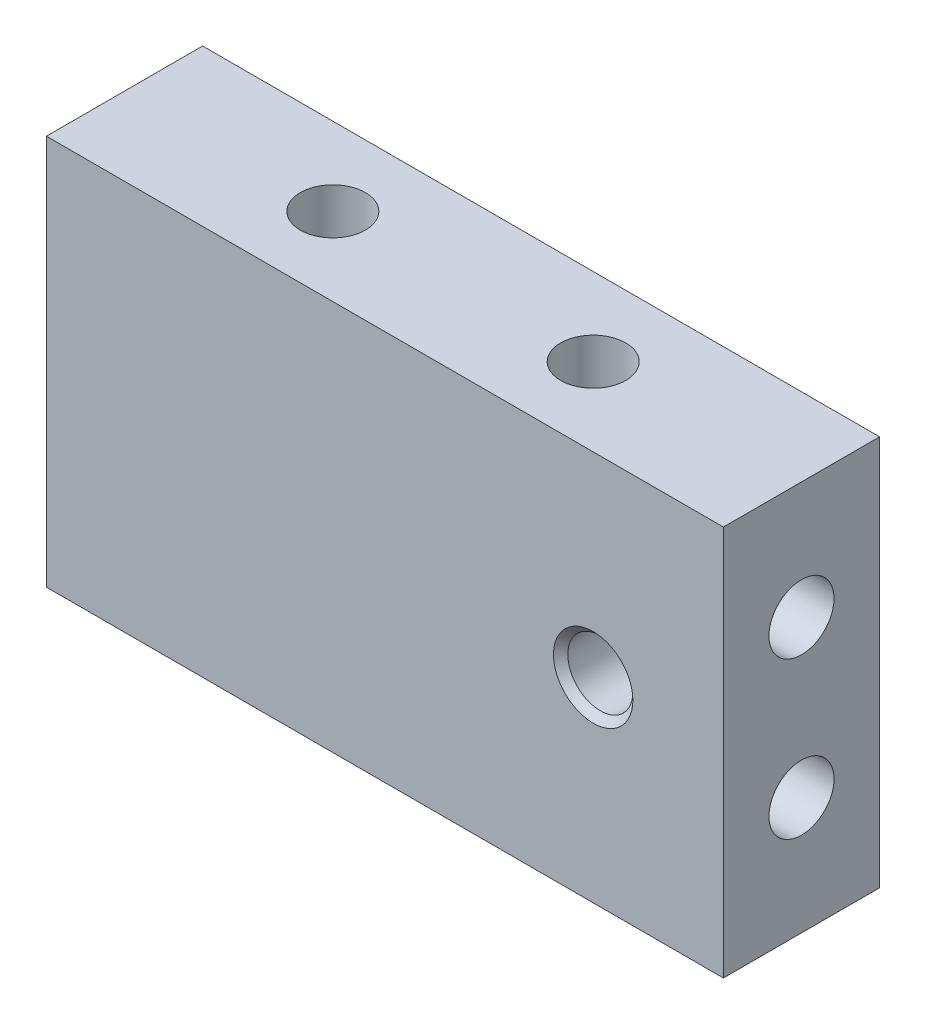
ISO-10303-21;
HEADER;
FILE_DESCRIPTION(('STEP AP214'),'2;1');
FILE_NAME('part.step','',(''),(''),'','','');
FILE_SCHEMA(('AUTOMOTIVE_DESIGN { 1 0 10303 214 1 1 1 1 }'));
ENDSEC;
DATA;
#1=APPLICATION_CONTEXT('core data for automotive mechanical design processes');
#2=APPLICATION_PROTOCOL_DEFINITION('international standard','automotive_design',2000,#1);
#3=PRODUCT_CONTEXT('',#1,'mechanical');
#4=PRODUCT('Part','Part','',(#3));
#5=PRODUCT_RELATED_PRODUCT_CATEGORY('part','',(#4));
#6=PRODUCT_DEFINITION_FORMATION('','',#4);
#7=PRODUCT_DEFINITION_CONTEXT('part definition',#1,'design');
#8=PRODUCT_DEFINITION('design','',#6,#7);
#9=PRODUCT_DEFINITION_SHAPE('','',#8);
#10=(LENGTH_UNIT() NAMED_UNIT(*) SI_UNIT(.MILLI.,.METRE.));
#11=(NAMED_UNIT(*) PLANE_ANGLE_UNIT() SI_UNIT($,.RADIAN.));
#12=(NAMED_UNIT(*) SI_UNIT($,.STERADIAN.) SOLID_ANGLE_UNIT());
#13=UNCERTAINTY_MEASURE_WITH_UNIT(LENGTH_MEASURE(1.E-05),#10,'distance_accuracy_value','');
#14=(GEOMETRIC_REPRESENTATION_CONTEXT(3) GLOBAL_UNCERTAINTY_ASSIGNED_CONTEXT((#13)) GLOBAL_UNIT_ASSIGNED_CONTEXT((#10,
#11,#12)) REPRESENTATION_CONTEXT('',''));
#15=CARTESIAN_POINT('',(0.,0.,0.));
#16=DIRECTION('',(0.,0.,1.));
#17=DIRECTION('',(1.,0.,0.));
#18=AXIS2_PLACEMENT_3D('',#15,#16,#17);
#19=CARTESIAN_POINT('',(13.,-7.5,5.));
#20=DIRECTION('',(-1.,0.,0.));
#21=DIRECTION('',(0.,0.,1.));
#22=AXIS2_PLACEMENT_3D('',#19,#20,#21);
#23=PLANE('',#22);
#24=CARTESIAN_POINT('',(13.,-3.,3.));
#25=DIRECTION('',(1.,0.,0.));
#26=DIRECTION('',(0.,0.,-1.));
#27=AXIS2_PLACEMENT_3D('',#24,#25,#26);
#28=CIRCLE('',#27,1.24999999999999);
#29=CARTESIAN_POINT('',(13.,-3.,1.75000000000001));
#30=VERTEX_POINT('',#29);
#31=EDGE_CURVE('E121',#30,#30,#28,.T.);
#32=ORIENTED_EDGE('',*,*,#31,.F.);
#33=EDGE_LOOP('',(#32));
#34=FACE_BOUND('',#33,.T.);
#35=CARTESIAN_POINT('',(13.,3.,3.));
#36=DIRECTION('',(1.,0.,0.));
#37=DIRECTION('',(0.,0.,-1.));
#38=AXIS2_PLACEMENT_3D('',#35,#36,#37);
#39=CIRCLE('',#38,1.24999999999999);
#40=CARTESIAN_POINT('',(13.,3.,1.75000000000001));
#41=VERTEX_POINT('',#40);
#42=EDGE_CURVE('E127',#41,#41,#39,.T.);
#43=ORIENTED_EDGE('',*,*,#42,.F.);
#44=EDGE_LOOP('',(#43));
#45=FACE_BOUND('',#44,.T.);
#46=DIRECTION('',(0.,1.,0.));
#47=VECTOR('',#46,1.);
#48=CARTESIAN_POINT('',(13.,-7.5,0.));
#49=LINE('',#48,#47);
#50=CARTESIAN_POINT('',(13.,-7.5,0.));
#51=VERTEX_POINT('',#50);
#52=CARTESIAN_POINT('',(13.,7.5,0.));
#53=VERTEX_POINT('',#52);
#54=EDGE_CURVE('E157',#51,#53,#49,.T.);
#55=ORIENTED_EDGE('',*,*,#54,.T.);
#56=DIRECTION('',(0.,0.,-1.));
#57=VECTOR('',#56,1.);
#58=CARTESIAN_POINT('',(13.,7.5,5.));
#59=LINE('',#58,#57);
#60=CARTESIAN_POINT('',(13.,7.5,6.));
#61=VERTEX_POINT('',#60);
#62=EDGE_CURVE('E11',#61,#53,#59,.T.);
#63=ORIENTED_EDGE('',*,*,#62,.F.);
#64=DIRECTION('',(0.,1.,0.));
#65=VECTOR('',#64,1.);
#66=CARTESIAN_POINT('',(13.,0.,6.));
#67=LINE('',#66,#65);
#68=CARTESIAN_POINT('',(13.,-7.5,6.));
#69=VERTEX_POINT('',#68);
#70=EDGE_CURVE('E148',#69,#61,#67,.T.);
#71=ORIENTED_EDGE('',*,*,#70,.F.);
#72=DIRECTION('',(0.,0.,-1.));
#73=VECTOR('',#72,1.);
#74=CARTESIAN_POINT('',(13.,-7.5,5.));
#75=LINE('',#74,#73);
#76=EDGE_CURVE('E164',#69,#51,#75,.T.);
#77=ORIENTED_EDGE('',*,*,#76,.T.);
#78=EDGE_LOOP('',(#55,#63,#71,#77));
#79=FACE_BOUND('',#78,.T.);
#80=ADVANCED_FACE('F41',(#34,#45,#79),#23,.F.);
#81=CARTESIAN_POINT('',(-13.,7.5,5.));
#82=DIRECTION('',(0.,-1.,0.));
#83=DIRECTION('',(0.,0.,-1.));
#84=AXIS2_PLACEMENT_3D('',#81,#82,#83);
#85=PLANE('',#84);
#86=CARTESIAN_POINT('',(-5.,7.5,3.));
#87=DIRECTION('',(0.,1.,0.));
#88=DIRECTION('',(0.,0.,1.));
#89=AXIS2_PLACEMENT_3D('',#86,#87,#88);
#90=CIRCLE('',#89,1.24999999999999);
#91=CARTESIAN_POINT('',(-5.,7.5,4.24999999999999));
#92=VERTEX_POINT('',#91);
#93=EDGE_CURVE('E109',#92,#92,#90,.T.);
#94=ORIENTED_EDGE('',*,*,#93,.F.);
#95=EDGE_LOOP('',(#94));
#96=FACE_BOUND('',#95,.T.);
#97=CARTESIAN_POINT('',(5.,7.5,3.));
#98=DIRECTION('',(0.,1.,0.));
#99=DIRECTION('',(0.,0.,1.));
#100=AXIS2_PLACEMENT_3D('',#97,#98,#99);
#101=CIRCLE('',#100,1.24999999999999);
#102=CARTESIAN_POINT('',(5.,7.5,4.24999999999999));
#103=VERTEX_POINT('',#102);
#104=EDGE_CURVE('E108',#103,#103,#101,.T.);
#105=ORIENTED_EDGE('',*,*,#104,.F.);
#106=EDGE_LOOP('',(#105));
#107=FACE_BOUND('',#106,.T.);
#108=DIRECTION('',(-1.,0.,0.));
#109=VECTOR('',#108,1.);
#110=CARTESIAN_POINT('',(-13.,7.5,0.));
#111=LINE('',#110,#109);
#112=CARTESIAN_POINT('',(-13.,7.5,0.));
#113=VERTEX_POINT('',#112);
#114=EDGE_CURVE('E160',#53,#113,#111,.T.);
#115=ORIENTED_EDGE('',*,*,#114,.T.);
#116=DIRECTION('',(0.,0.,-1.));
#117=VECTOR('',#116,1.);
#118=CARTESIAN_POINT('',(-13.,7.5,5.));
#119=LINE('',#118,#117);
#120=CARTESIAN_POINT('',(-13.,7.5,6.));
#121=VERTEX_POINT('',#120);
#122=EDGE_CURVE('E48',#121,#113,#119,.T.);
#123=ORIENTED_EDGE('',*,*,#122,.F.);
#124=DIRECTION('',(-1.,0.,0.));
#125=VECTOR('',#124,1.);
#126=CARTESIAN_POINT('',(0.,7.5,6.));
#127=LINE('',#126,#125);
#128=EDGE_CURVE('E151',#61,#121,#127,.T.);
#129=ORIENTED_EDGE('',*,*,#128,.F.);
#130=ORIENTED_EDGE('',*,*,#62,.T.);
#131=EDGE_LOOP('',(#115,#123,#129,#130));
#132=FACE_BOUND('',#131,.T.);
#133=ADVANCED_FACE('F180',(#96,#107,#132),#85,.F.);
#134=CARTESIAN_POINT('',(-13.,-7.5,5.));
#135=DIRECTION('',(1.,0.,0.));
#136=DIRECTION('',(0.,0.,-1.));
#137=AXIS2_PLACEMENT_3D('',#134,#135,#136);
#138=PLANE('',#137);
#139=CARTESIAN_POINT('',(-13.,-3.,3.));
#140=DIRECTION('',(-1.,0.,0.));
#141=DIRECTION('',(0.,0.,1.));
#142=AXIS2_PLACEMENT_3D('',#139,#140,#141);
#143=CIRCLE('',#142,1.24999999999999);
#144=CARTESIAN_POINT('',(-13.,-3.,4.24999999999999));
#145=VERTEX_POINT('',#144);
#146=EDGE_CURVE('E133',#145,#145,#143,.T.);
#147=ORIENTED_EDGE('',*,*,#146,.F.);
#148=EDGE_LOOP('',(#147));
#149=FACE_BOUND('',#148,.T.);
#150=CARTESIAN_POINT('',(-13.,3.,3.));
#151=DIRECTION('',(-1.,0.,0.));
#152=DIRECTION('',(0.,0.,1.));
#153=AXIS2_PLACEMENT_3D('',#150,#151,#152);
#154=CIRCLE('',#153,1.24999999999999);
#155=CARTESIAN_POINT('',(-13.,3.,4.24999999999999));
#156=VERTEX_POINT('',#155);
#157=EDGE_CURVE('E139',#156,#156,#154,.T.);
#158=ORIENTED_EDGE('',*,*,#157,.F.);
#159=EDGE_LOOP('',(#158));
#160=FACE_BOUND('',#159,.T.);
#161=DIRECTION('',(0.,-1.,0.));
#162=VECTOR('',#161,1.);
#163=CARTESIAN_POINT('',(-13.,-7.5,0.));
#164=LINE('',#163,#162);
#165=CARTESIAN_POINT('',(-13.,-7.5,0.));
#166=VERTEX_POINT('',#165);
#167=EDGE_CURVE('E63',#113,#166,#164,.T.);
#168=ORIENTED_EDGE('',*,*,#167,.T.);
#169=DIRECTION('',(0.,0.,-1.));
#170=VECTOR('',#169,1.);
#171=CARTESIAN_POINT('',(-13.,-7.5,5.));
#172=LINE('',#171,#170);
#173=CARTESIAN_POINT('',(-13.,-7.5,6.));
#174=VERTEX_POINT('',#173);
#175=EDGE_CURVE('E166',#174,#166,#172,.T.);
#176=ORIENTED_EDGE('',*,*,#175,.F.);
#177=DIRECTION('',(0.,-1.,0.));
#178=VECTOR('',#177,1.);
#179=CARTESIAN_POINT('',(-13.,0.,6.));
#180=LINE('',#179,#178);
#181=EDGE_CURVE('E154',#121,#174,#180,.T.);
#182=ORIENTED_EDGE('',*,*,#181,.F.);
#183=ORIENTED_EDGE('',*,*,#122,.T.);
#184=EDGE_LOOP('',(#168,#176,#182,#183));
#185=FACE_BOUND('',#184,.T.);
#186=ADVANCED_FACE('F168',(#149,#160,#185),#138,.F.);
#187=CARTESIAN_POINT('',(-13.,-7.5,5.));
#188=DIRECTION('',(0.,1.,0.));
#189=DIRECTION('',(0.,0.,1.));
#190=AXIS2_PLACEMENT_3D('',#187,#188,#189);
#191=PLANE('',#190);
#192=DIRECTION('',(1.,0.,0.));
#193=VECTOR('',#192,1.);
#194=CARTESIAN_POINT('',(-13.,-7.5,0.));
#195=LINE('',#194,#193);
#196=EDGE_CURVE('E55',#166,#51,#195,.T.);
#197=ORIENTED_EDGE('',*,*,#196,.T.);
#198=ORIENTED_EDGE('',*,*,#76,.F.);
#199=DIRECTION('',(1.,0.,0.));
#200=VECTOR('',#199,1.);
#201=CARTESIAN_POINT('',(0.,-7.5,6.));
#202=LINE('',#201,#200);
#203=EDGE_CURVE('E145',#174,#69,#202,.T.);
#204=ORIENTED_EDGE('',*,*,#203,.F.);
#205=ORIENTED_EDGE('',*,*,#175,.T.);
#206=EDGE_LOOP('',(#197,#198,#204,#205));
#207=FACE_BOUND('',#206,.T.);
#208=ADVANCED_FACE('F177',(#207),#191,.F.);
#209=CARTESIAN_POINT('',(0.,0.,0.));
#210=DIRECTION('',(0.,0.,-1.));
#211=DIRECTION('',(-1.,0.,0.));
#212=AXIS2_PLACEMENT_3D('',#209,#210,#211);
#213=PLANE('',#212);
#214=CARTESIAN_POINT('',(8.,0.,0.));
#215=DIRECTION('',(0.,0.,1.));
#216=DIRECTION('',(1.,0.,0.));
#217=AXIS2_PLACEMENT_3D('',#214,#215,#216);
#218=CIRCLE('',#217,1.25);
#219=CARTESIAN_POINT('',(9.25,0.,0.));
#220=VERTEX_POINT('',#219);
#221=EDGE_CURVE('E115',#220,#220,#218,.T.);
#222=ORIENTED_EDGE('',*,*,#221,.T.);
#223=EDGE_LOOP('',(#222));
#224=FACE_BOUND('',#223,.T.);
#225=ORIENTED_EDGE('',*,*,#54,.F.);
#226=ORIENTED_EDGE('',*,*,#196,.F.);
#227=ORIENTED_EDGE('',*,*,#167,.F.);
#228=ORIENTED_EDGE('',*,*,#114,.F.);
#229=EDGE_LOOP('',(#225,#226,#227,#228));
#230=FACE_BOUND('',#229,.T.);
#231=ADVANCED_FACE('F173',(#224,#230),#213,.T.);
#232=CARTESIAN_POINT('',(0.,0.,6.));
#233=DIRECTION('',(0.,0.,1.));
#234=DIRECTION('',(1.,0.,0.));
#235=AXIS2_PLACEMENT_3D('',#232,#233,#234);
#236=PLANE('',#235);
#237=CARTESIAN_POINT('',(8.,0.,6.));
#238=DIRECTION('',(0.,0.,1.));
#239=DIRECTION('',(1.,0.,0.));
#240=AXIS2_PLACEMENT_3D('',#237,#238,#239);
#241=CIRCLE('',#240,1.525);
#242=CARTESIAN_POINT('',(9.525,0.,6.));
#243=VERTEX_POINT('',#242);
#244=EDGE_CURVE('E257',#243,#243,#241,.T.);
#245=ORIENTED_EDGE('',*,*,#244,.F.);
#246=EDGE_LOOP('',(#245));
#247=FACE_BOUND('',#246,.T.);
#248=ORIENTED_EDGE('',*,*,#203,.T.);
#249=ORIENTED_EDGE('',*,*,#70,.T.);
#250=ORIENTED_EDGE('',*,*,#128,.T.);
#251=ORIENTED_EDGE('',*,*,#181,.T.);
#252=EDGE_LOOP('',(#248,#249,#250,#251));
#253=FACE_BOUND('',#252,.T.);
#254=ADVANCED_FACE('F179',(#247,#253),#236,.T.);
#255=CARTESIAN_POINT('',(-8.,3.,3.));
#256=DIRECTION('',(-1.,0.,0.));
#257=DIRECTION('',(0.,0.,1.));
#258=AXIS2_PLACEMENT_3D('',#255,#256,#257);
#259=CONICAL_SURFACE('',#258,1.25,1.02974425867665);
#260=CARTESIAN_POINT('',(-7.24892422621555,3.,3.));
#261=VERTEX_POINT('',#260);
#262=VERTEX_LOOP('',#261);
#263=FACE_BOUND('',#262,.T.);
#264=CARTESIAN_POINT('',(-8.,3.,3.));
#265=DIRECTION('',(-1.,0.,0.));
#266=DIRECTION('',(0.,0.,1.));
#267=AXIS2_PLACEMENT_3D('',#264,#265,#266);
#268=CIRCLE('',#267,1.25);
#269=CARTESIAN_POINT('',(-8.,3.,4.25));
#270=VERTEX_POINT('',#269);
#271=EDGE_CURVE('E142',#270,#270,#268,.T.);
#272=ORIENTED_EDGE('',*,*,#271,.T.);
#273=EDGE_LOOP('',(#272));
#274=FACE_BOUND('',#273,.T.);
#275=ADVANCED_FACE('F200',(#263,#274),#259,.F.);
#276=CARTESIAN_POINT('',(-13.,3.,3.));
#277=DIRECTION('',(-1.,0.,0.));
#278=DIRECTION('',(0.,0.,1.));
#279=AXIS2_PLACEMENT_3D('',#276,#277,#278);
#280=CYLINDRICAL_SURFACE('',#279,1.24999999999999);
#281=ORIENTED_EDGE('',*,*,#271,.F.);
#282=EDGE_LOOP('',(#281));
#283=FACE_BOUND('',#282,.T.);
#284=ORIENTED_EDGE('',*,*,#157,.T.);
#285=EDGE_LOOP('',(#284));
#286=FACE_BOUND('',#285,.T.);
#287=ADVANCED_FACE('F204',(#283,#286),#280,.F.);
#288=CARTESIAN_POINT('',(-8.,-3.,3.));
#289=DIRECTION('',(-1.,0.,0.));
#290=DIRECTION('',(0.,0.,1.));
#291=AXIS2_PLACEMENT_3D('',#288,#289,#290);
#292=CONICAL_SURFACE('',#291,1.25,1.02974425867665);
#293=CARTESIAN_POINT('',(-7.24892422621555,-3.,3.));
#294=VERTEX_POINT('',#293);
#295=VERTEX_LOOP('',#294);
#296=FACE_BOUND('',#295,.T.);
#297=CARTESIAN_POINT('',(-8.,-3.,3.));
#298=DIRECTION('',(-1.,0.,0.));
#299=DIRECTION('',(0.,0.,1.));
#300=AXIS2_PLACEMENT_3D('',#297,#298,#299);
#301=CIRCLE('',#300,1.25);
#302=CARTESIAN_POINT('',(-8.,-3.,4.25));
#303=VERTEX_POINT('',#302);
#304=EDGE_CURVE('E136',#303,#303,#301,.T.);
#305=ORIENTED_EDGE('',*,*,#304,.T.);
#306=EDGE_LOOP('',(#305));
#307=FACE_BOUND('',#306,.T.);
#308=ADVANCED_FACE('F208',(#296,#307),#292,.F.);
#309=CARTESIAN_POINT('',(-13.,-3.,3.));
#310=DIRECTION('',(-1.,0.,0.));
#311=DIRECTION('',(0.,0.,1.));
#312=AXIS2_PLACEMENT_3D('',#309,#310,#311);
#313=CYLINDRICAL_SURFACE('',#312,1.24999999999999);
#314=ORIENTED_EDGE('',*,*,#304,.F.);
#315=EDGE_LOOP('',(#314));
#316=FACE_BOUND('',#315,.T.);
#317=ORIENTED_EDGE('',*,*,#146,.T.);
#318=EDGE_LOOP('',(#317));
#319=FACE_BOUND('',#318,.T.);
#320=ADVANCED_FACE('F212',(#316,#319),#313,.F.);
#321=CARTESIAN_POINT('',(8.,3.,3.));
#322=DIRECTION('',(1.,0.,0.));
#323=DIRECTION('',(0.,0.,-1.));
#324=AXIS2_PLACEMENT_3D('',#321,#322,#323);
#325=CONICAL_SURFACE('',#324,1.25,1.02974425867665);
#326=CARTESIAN_POINT('',(7.24892422621555,3.,3.));
#327=VERTEX_POINT('',#326);
#328=VERTEX_LOOP('',#327);
#329=FACE_BOUND('',#328,.T.);
#330=CARTESIAN_POINT('',(8.,3.,3.));
#331=DIRECTION('',(1.,0.,0.));
#332=DIRECTION('',(0.,0.,-1.));
#333=AXIS2_PLACEMENT_3D('',#330,#331,#332);
#334=CIRCLE('',#333,1.25);
#335=CARTESIAN_POINT('',(8.,3.,1.75));
#336=VERTEX_POINT('',#335);
#337=EDGE_CURVE('E130',#336,#336,#334,.T.);
#338=ORIENTED_EDGE('',*,*,#337,.T.);
#339=EDGE_LOOP('',(#338));
#340=FACE_BOUND('',#339,.T.);
#341=ADVANCED_FACE('F216',(#329,#340),#325,.F.);
#342=CARTESIAN_POINT('',(13.,3.,3.));
#343=DIRECTION('',(1.,0.,0.));
#344=DIRECTION('',(0.,0.,-1.));
#345=AXIS2_PLACEMENT_3D('',#342,#343,#344);
#346=CYLINDRICAL_SURFACE('',#345,1.24999999999999);
#347=ORIENTED_EDGE('',*,*,#337,.F.);
#348=EDGE_LOOP('',(#347));
#349=FACE_BOUND('',#348,.T.);
#350=ORIENTED_EDGE('',*,*,#42,.T.);
#351=EDGE_LOOP('',(#350));
#352=FACE_BOUND('',#351,.T.);
#353=ADVANCED_FACE('F220',(#349,#352),#346,.F.);
#354=CARTESIAN_POINT('',(8.,-3.,3.));
#355=DIRECTION('',(1.,0.,0.));
#356=DIRECTION('',(0.,0.,-1.));
#357=AXIS2_PLACEMENT_3D('',#354,#355,#356);
#358=CONICAL_SURFACE('',#357,1.25,1.02974425867665);
#359=CARTESIAN_POINT('',(7.24892422621555,-3.,3.));
#360=VERTEX_POINT('',#359);
#361=VERTEX_LOOP('',#360);
#362=FACE_BOUND('',#361,.T.);
#363=CARTESIAN_POINT('',(8.,-3.,3.));
#364=DIRECTION('',(1.,0.,0.));
#365=DIRECTION('',(0.,0.,-1.));
#366=AXIS2_PLACEMENT_3D('',#363,#364,#365);
#367=CIRCLE('',#366,1.25);
#368=CARTESIAN_POINT('',(8.,-3.,1.75));
#369=VERTEX_POINT('',#368);
#370=EDGE_CURVE('E124',#369,#369,#367,.T.);
#371=ORIENTED_EDGE('',*,*,#370,.T.);
#372=EDGE_LOOP('',(#371));
#373=FACE_BOUND('',#372,.T.);
#374=ADVANCED_FACE('F224',(#362,#373),#358,.F.);
#375=CARTESIAN_POINT('',(13.,-3.,3.));
#376=DIRECTION('',(1.,0.,0.));
#377=DIRECTION('',(0.,0.,-1.));
#378=AXIS2_PLACEMENT_3D('',#375,#376,#377);
#379=CYLINDRICAL_SURFACE('',#378,1.24999999999999);
#380=ORIENTED_EDGE('',*,*,#370,.F.);
#381=EDGE_LOOP('',(#380));
#382=FACE_BOUND('',#381,.T.);
#383=ORIENTED_EDGE('',*,*,#31,.T.);
#384=EDGE_LOOP('',(#383));
#385=FACE_BOUND('',#384,.T.);
#386=ADVANCED_FACE('F228',(#382,#385),#379,.F.);
#387=CARTESIAN_POINT('',(5.,0.499999999999994,3.));
#388=DIRECTION('',(0.,1.,0.));
#389=DIRECTION('',(0.,0.,1.));
#390=AXIS2_PLACEMENT_3D('',#387,#388,#389);
#391=CONICAL_SURFACE('',#390,1.24999999999999,1.02974425867665);
#392=CARTESIAN_POINT('',(5.,-0.25107577378445,3.));
#393=VERTEX_POINT('',#392);
#394=VERTEX_LOOP('',#393);
#395=FACE_BOUND('',#394,.T.);
#396=CARTESIAN_POINT('',(5.,0.499999999999994,3.));
#397=DIRECTION('',(0.,1.,0.));
#398=DIRECTION('',(0.,0.,1.));
#399=AXIS2_PLACEMENT_3D('',#396,#397,#398);
#400=CIRCLE('',#399,1.24999999999999);
#401=CARTESIAN_POINT('',(5.,0.499999999999994,4.24999999999999));
#402=VERTEX_POINT('',#401);
#403=EDGE_CURVE('E112',#402,#402,#400,.T.);
#404=ORIENTED_EDGE('',*,*,#403,.T.);
#405=EDGE_LOOP('',(#404));
#406=FACE_BOUND('',#405,.T.);
#407=ADVANCED_FACE('F232',(#395,#406),#391,.F.);
#408=CARTESIAN_POINT('',(5.,7.5,3.));
#409=DIRECTION('',(0.,1.,0.));
#410=DIRECTION('',(0.,0.,1.));
#411=AXIS2_PLACEMENT_3D('',#408,#409,#410);
#412=CYLINDRICAL_SURFACE('',#411,1.24999999999999);
#413=ORIENTED_EDGE('',*,*,#403,.F.);
#414=EDGE_LOOP('',(#413));
#415=FACE_BOUND('',#414,.T.);
#416=ORIENTED_EDGE('',*,*,#104,.T.);
#417=EDGE_LOOP('',(#416));
#418=FACE_BOUND('',#417,.T.);
#419=ADVANCED_FACE('F102',(#415,#418),#412,.F.);
#420=CARTESIAN_POINT('',(-5.,0.499999999999994,3.));
#421=DIRECTION('',(0.,1.,0.));
#422=DIRECTION('',(0.,0.,1.));
#423=AXIS2_PLACEMENT_3D('',#420,#421,#422);
#424=CONICAL_SURFACE('',#423,1.24999999999999,1.02974425867665);
#425=CARTESIAN_POINT('',(-5.,-0.25107577378445,3.));
#426=VERTEX_POINT('',#425);
#427=VERTEX_LOOP('',#426);
#428=FACE_BOUND('',#427,.T.);
#429=CARTESIAN_POINT('',(-5.,0.499999999999994,3.));
#430=DIRECTION('',(0.,1.,0.));
#431=DIRECTION('',(0.,0.,1.));
#432=AXIS2_PLACEMENT_3D('',#429,#430,#431);
#433=CIRCLE('',#432,1.24999999999999);
#434=CARTESIAN_POINT('',(-5.,0.499999999999994,4.24999999999999));
#435=VERTEX_POINT('',#434);
#436=EDGE_CURVE('E106',#435,#435,#433,.T.);
#437=ORIENTED_EDGE('',*,*,#436,.T.);
#438=EDGE_LOOP('',(#437));
#439=FACE_BOUND('',#438,.T.);
#440=ADVANCED_FACE('F98',(#428,#439),#424,.F.);
#441=CARTESIAN_POINT('',(-5.,7.5,3.));
#442=DIRECTION('',(0.,1.,0.));
#443=DIRECTION('',(0.,0.,1.));
#444=AXIS2_PLACEMENT_3D('',#441,#442,#443);
#445=CYLINDRICAL_SURFACE('',#444,1.24999999999999);
#446=ORIENTED_EDGE('',*,*,#436,.F.);
#447=EDGE_LOOP('',(#446));
#448=FACE_BOUND('',#447,.T.);
#449=ORIENTED_EDGE('',*,*,#93,.T.);
#450=EDGE_LOOP('',(#449));
#451=FACE_BOUND('',#450,.T.);
#452=ADVANCED_FACE('F101',(#448,#451),#445,.F.);
#453=CARTESIAN_POINT('',(8.,0.,6.));
#454=DIRECTION('',(0.,0.,1.));
#455=DIRECTION('',(1.,0.,0.));
#456=AXIS2_PLACEMENT_3D('',#453,#454,#455);
#457=CYLINDRICAL_SURFACE('',#456,1.24999999999999);
#458=ORIENTED_EDGE('',*,*,#221,.F.);
#459=EDGE_LOOP('',(#458));
#460=FACE_BOUND('',#459,.T.);
#461=CARTESIAN_POINT('',(8.,0.,5.72499999999999));
#462=DIRECTION('',(0.,0.,1.));
#463=DIRECTION('',(1.,0.,0.));
#464=AXIS2_PLACEMENT_3D('',#461,#462,#463);
#465=CIRCLE('',#464,1.24999999999999);
#466=CARTESIAN_POINT('',(9.24999999999999,0.,5.72499999999999));
#467=VERTEX_POINT('',#466);
#468=EDGE_CURVE('E254',#467,#467,#465,.T.);
#469=ORIENTED_EDGE('',*,*,#468,.T.);
#470=EDGE_LOOP('',(#469));
#471=FACE_BOUND('',#470,.T.);
#472=ADVANCED_FACE('F242',(#460,#471),#457,.F.);
#473=CARTESIAN_POINT('',(8.,0.,6.));
#474=DIRECTION('',(0.,0.,1.));
#475=DIRECTION('',(1.,0.,0.));
#476=AXIS2_PLACEMENT_3D('',#473,#474,#475);
#477=CONICAL_SURFACE('',#476,1.525,0.785398163397448);
#478=ORIENTED_EDGE('',*,*,#468,.F.);
#479=EDGE_LOOP('',(#478));
#480=FACE_BOUND('',#479,.T.);
#481=ORIENTED_EDGE('',*,*,#244,.T.);
#482=EDGE_LOOP('',(#481));
#483=FACE_BOUND('',#482,.T.);
#484=ADVANCED_FACE('F245',(#480,#483),#477,.F.);
#485=CLOSED_SHELL('',(#80,#133,#186,#208,#231,#254,#275,#287,#308,#320,#341,#353,#374,#386,#407,
#419,#440,#452,#472,#484));
#486=MANIFOLD_SOLID_BREP('B2',#485);
#487=ADVANCED_BREP_SHAPE_REPRESENTATION('',(#18,#486),#14);
#488=SHAPE_DEFINITION_REPRESENTATION(#9,#487);
ENDSEC;
END-ISO-10303-21;
